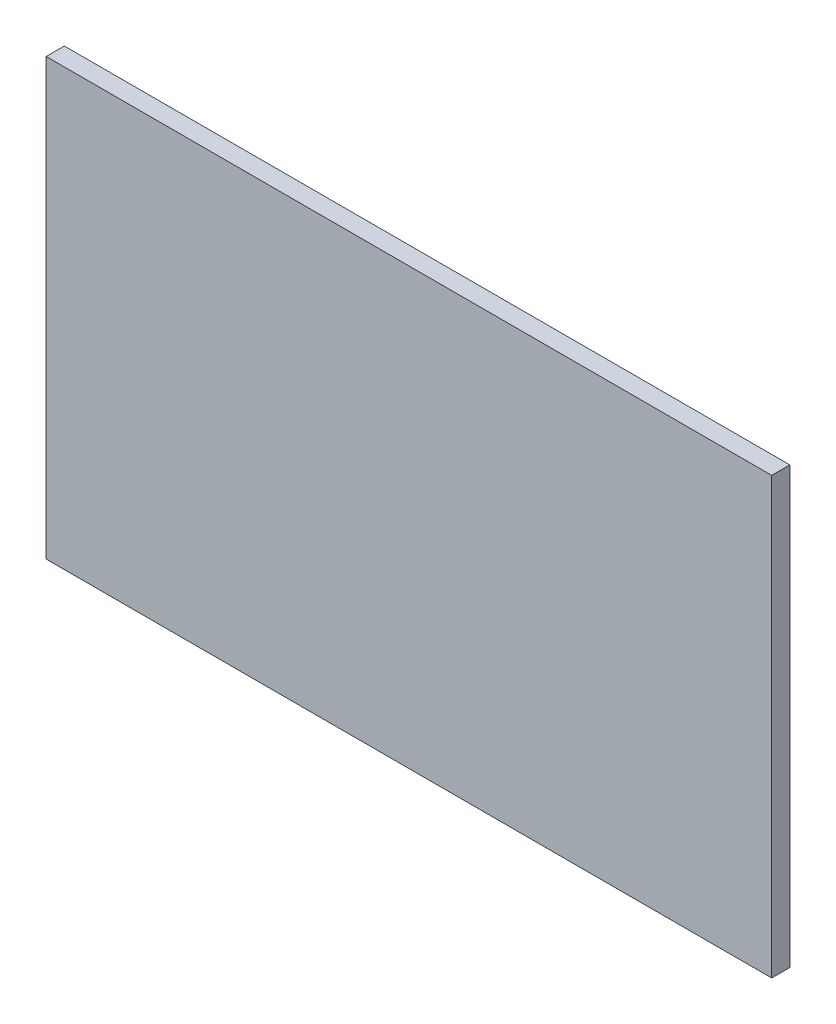
ISO-10303-21;
HEADER;
FILE_DESCRIPTION(('STEP AP214'),'2;1');
FILE_NAME('part.step','',(''),(''),'','','');
FILE_SCHEMA(('AUTOMOTIVE_DESIGN { 1 0 10303 214 1 1 1 1 }'));
ENDSEC;
DATA;
#1=APPLICATION_CONTEXT('core data for automotive mechanical design processes');
#2=APPLICATION_PROTOCOL_DEFINITION('international standard','automotive_design',2000,#1);
#3=PRODUCT_CONTEXT('',#1,'mechanical');
#4=PRODUCT('Part','Part','',(#3));
#5=PRODUCT_RELATED_PRODUCT_CATEGORY('part','',(#4));
#6=PRODUCT_DEFINITION_FORMATION('','',#4);
#7=PRODUCT_DEFINITION_CONTEXT('part definition',#1,'design');
#8=PRODUCT_DEFINITION('design','',#6,#7);
#9=PRODUCT_DEFINITION_SHAPE('','',#8);
#10=(LENGTH_UNIT() NAMED_UNIT(*) SI_UNIT(.MILLI.,.METRE.));
#11=(NAMED_UNIT(*) PLANE_ANGLE_UNIT() SI_UNIT($,.RADIAN.));
#12=(NAMED_UNIT(*) SI_UNIT($,.STERADIAN.) SOLID_ANGLE_UNIT());
#13=UNCERTAINTY_MEASURE_WITH_UNIT(LENGTH_MEASURE(1.E-05),#10,'distance_accuracy_value','');
#14=(GEOMETRIC_REPRESENTATION_CONTEXT(3) GLOBAL_UNCERTAINTY_ASSIGNED_CONTEXT((#13)) GLOBAL_UNIT_ASSIGNED_CONTEXT((#10,
#11,#12)) REPRESENTATION_CONTEXT('',''));
#15=CARTESIAN_POINT('',(0.,0.,0.));
#16=DIRECTION('',(0.,0.,1.));
#17=DIRECTION('',(1.,0.,0.));
#18=AXIS2_PLACEMENT_3D('',#15,#16,#17);
#19=CARTESIAN_POINT('',(254.,-152.4,12.7));
#20=DIRECTION('',(-1.,0.,0.));
#21=DIRECTION('',(0.,0.,1.));
#22=AXIS2_PLACEMENT_3D('',#19,#20,#21);
#23=PLANE('',#22);
#24=DIRECTION('',(0.,1.,0.));
#25=VECTOR('',#24,1.);
#26=CARTESIAN_POINT('',(254.,-152.4,0.));
#27=LINE('',#26,#25);
#28=CARTESIAN_POINT('',(254.,-152.4,0.));
#29=VERTEX_POINT('',#28);
#30=CARTESIAN_POINT('',(254.,152.4,0.));
#31=VERTEX_POINT('',#30);
#32=EDGE_CURVE('E96',#29,#31,#27,.T.);
#33=ORIENTED_EDGE('',*,*,#32,.T.);
#34=DIRECTION('',(0.,0.,-1.));
#35=VECTOR('',#34,1.);
#36=CARTESIAN_POINT('',(254.,152.4,12.7));
#37=LINE('',#36,#35);
#38=CARTESIAN_POINT('',(254.,152.4,12.7));
#39=VERTEX_POINT('',#38);
#40=EDGE_CURVE('E11',#39,#31,#37,.T.);
#41=ORIENTED_EDGE('',*,*,#40,.F.);
#42=DIRECTION('',(0.,1.,0.));
#43=VECTOR('',#42,1.);
#44=CARTESIAN_POINT('',(254.,-152.4,12.7));
#45=LINE('',#44,#43);
#46=CARTESIAN_POINT('',(254.,-152.4,12.7));
#47=VERTEX_POINT('',#46);
#48=EDGE_CURVE('E84',#47,#39,#45,.T.);
#49=ORIENTED_EDGE('',*,*,#48,.F.);
#50=DIRECTION('',(0.,0.,-1.));
#51=VECTOR('',#50,1.);
#52=CARTESIAN_POINT('',(254.,-152.4,12.7));
#53=LINE('',#52,#51);
#54=EDGE_CURVE('E92',#47,#29,#53,.T.);
#55=ORIENTED_EDGE('',*,*,#54,.T.);
#56=EDGE_LOOP('',(#33,#41,#49,#55));
#57=FACE_BOUND('',#56,.T.);
#58=ADVANCED_FACE('F33',(#57),#23,.F.);
#59=CARTESIAN_POINT('',(-254.,152.4,12.7));
#60=DIRECTION('',(0.,-1.,0.));
#61=DIRECTION('',(0.,0.,-1.));
#62=AXIS2_PLACEMENT_3D('',#59,#60,#61);
#63=PLANE('',#62);
#64=DIRECTION('',(-1.,0.,0.));
#65=VECTOR('',#64,1.);
#66=CARTESIAN_POINT('',(-254.,152.4,0.));
#67=LINE('',#66,#65);
#68=CARTESIAN_POINT('',(-254.,152.4,0.));
#69=VERTEX_POINT('',#68);
#70=EDGE_CURVE('E88',#31,#69,#67,.T.);
#71=ORIENTED_EDGE('',*,*,#70,.T.);
#72=DIRECTION('',(0.,0.,-1.));
#73=VECTOR('',#72,1.);
#74=CARTESIAN_POINT('',(-254.,152.4,12.7));
#75=LINE('',#74,#73);
#76=CARTESIAN_POINT('',(-254.,152.4,12.7));
#77=VERTEX_POINT('',#76);
#78=EDGE_CURVE('E41',#77,#69,#75,.T.);
#79=ORIENTED_EDGE('',*,*,#78,.F.);
#80=DIRECTION('',(-1.,0.,0.));
#81=VECTOR('',#80,1.);
#82=CARTESIAN_POINT('',(-254.,152.4,12.7));
#83=LINE('',#82,#81);
#84=EDGE_CURVE('E79',#39,#77,#83,.T.);
#85=ORIENTED_EDGE('',*,*,#84,.F.);
#86=ORIENTED_EDGE('',*,*,#40,.T.);
#87=EDGE_LOOP('',(#71,#79,#85,#86));
#88=FACE_BOUND('',#87,.T.);
#89=ADVANCED_FACE('F87',(#88),#63,.F.);
#90=CARTESIAN_POINT('',(-254.,-152.4,12.7));
#91=DIRECTION('',(1.,0.,0.));
#92=DIRECTION('',(0.,0.,-1.));
#93=AXIS2_PLACEMENT_3D('',#90,#91,#92);
#94=PLANE('',#93);
#95=DIRECTION('',(0.,-1.,0.));
#96=VECTOR('',#95,1.);
#97=CARTESIAN_POINT('',(-254.,-152.4,0.));
#98=LINE('',#97,#96);
#99=CARTESIAN_POINT('',(-254.,-152.4,0.));
#100=VERTEX_POINT('',#99);
#101=EDGE_CURVE('E66',#69,#100,#98,.T.);
#102=ORIENTED_EDGE('',*,*,#101,.T.);
#103=DIRECTION('',(0.,0.,-1.));
#104=VECTOR('',#103,1.);
#105=CARTESIAN_POINT('',(-254.,-152.4,12.7));
#106=LINE('',#105,#104);
#107=CARTESIAN_POINT('',(-254.,-152.4,12.7));
#108=VERTEX_POINT('',#107);
#109=EDGE_CURVE('E89',#108,#100,#106,.T.);
#110=ORIENTED_EDGE('',*,*,#109,.F.);
#111=DIRECTION('',(0.,-1.,0.));
#112=VECTOR('',#111,1.);
#113=CARTESIAN_POINT('',(-254.,-152.4,12.7));
#114=LINE('',#113,#112);
#115=EDGE_CURVE('E82',#77,#108,#114,.T.);
#116=ORIENTED_EDGE('',*,*,#115,.F.);
#117=ORIENTED_EDGE('',*,*,#78,.T.);
#118=EDGE_LOOP('',(#102,#110,#116,#117));
#119=FACE_BOUND('',#118,.T.);
#120=ADVANCED_FACE('F90',(#119),#94,.F.);
#121=CARTESIAN_POINT('',(-254.,-152.4,12.7));
#122=DIRECTION('',(0.,1.,0.));
#123=DIRECTION('',(0.,0.,1.));
#124=AXIS2_PLACEMENT_3D('',#121,#122,#123);
#125=PLANE('',#124);
#126=DIRECTION('',(1.,0.,0.));
#127=VECTOR('',#126,1.);
#128=CARTESIAN_POINT('',(-254.,-152.4,0.));
#129=LINE('',#128,#127);
#130=EDGE_CURVE('E72',#100,#29,#129,.T.);
#131=ORIENTED_EDGE('',*,*,#130,.T.);
#132=ORIENTED_EDGE('',*,*,#54,.F.);
#133=DIRECTION('',(1.,0.,0.));
#134=VECTOR('',#133,1.);
#135=CARTESIAN_POINT('',(-254.,-152.4,12.7));
#136=LINE('',#135,#134);
#137=EDGE_CURVE('E49',#108,#47,#136,.T.);
#138=ORIENTED_EDGE('',*,*,#137,.F.);
#139=ORIENTED_EDGE('',*,*,#109,.T.);
#140=EDGE_LOOP('',(#131,#132,#138,#139));
#141=FACE_BOUND('',#140,.T.);
#142=ADVANCED_FACE('F103',(#141),#125,.F.);
#143=CARTESIAN_POINT('',(0.,0.,12.7));
#144=DIRECTION('',(0.,0.,-1.));
#145=DIRECTION('',(-1.,0.,0.));
#146=AXIS2_PLACEMENT_3D('',#143,#144,#145);
#147=PLANE('',#146);
#148=ORIENTED_EDGE('',*,*,#48,.T.);
#149=ORIENTED_EDGE('',*,*,#84,.T.);
#150=ORIENTED_EDGE('',*,*,#115,.T.);
#151=ORIENTED_EDGE('',*,*,#137,.T.);
#152=EDGE_LOOP('',(#148,#149,#150,#151));
#153=FACE_BOUND('',#152,.T.);
#154=ADVANCED_FACE('F80',(#153),#147,.F.);
#155=CARTESIAN_POINT('',(0.,0.,0.));
#156=DIRECTION('',(0.,0.,-1.));
#157=DIRECTION('',(-1.,0.,0.));
#158=AXIS2_PLACEMENT_3D('',#155,#156,#157);
#159=PLANE('',#158);
#160=ORIENTED_EDGE('',*,*,#32,.F.);
#161=ORIENTED_EDGE('',*,*,#130,.F.);
#162=ORIENTED_EDGE('',*,*,#101,.F.);
#163=ORIENTED_EDGE('',*,*,#70,.F.);
#164=EDGE_LOOP('',(#160,#161,#162,#163));
#165=FACE_BOUND('',#164,.T.);
#166=ADVANCED_FACE('F106',(#165),#159,.T.);
#167=CLOSED_SHELL('',(#58,#89,#120,#142,#154,#166));
#168=MANIFOLD_SOLID_BREP('B2',#167);
#169=ADVANCED_BREP_SHAPE_REPRESENTATION('',(#18,#168),#14);
#170=SHAPE_DEFINITION_REPRESENTATION(#9,#169);
ENDSEC;
END-ISO-10303-21;
